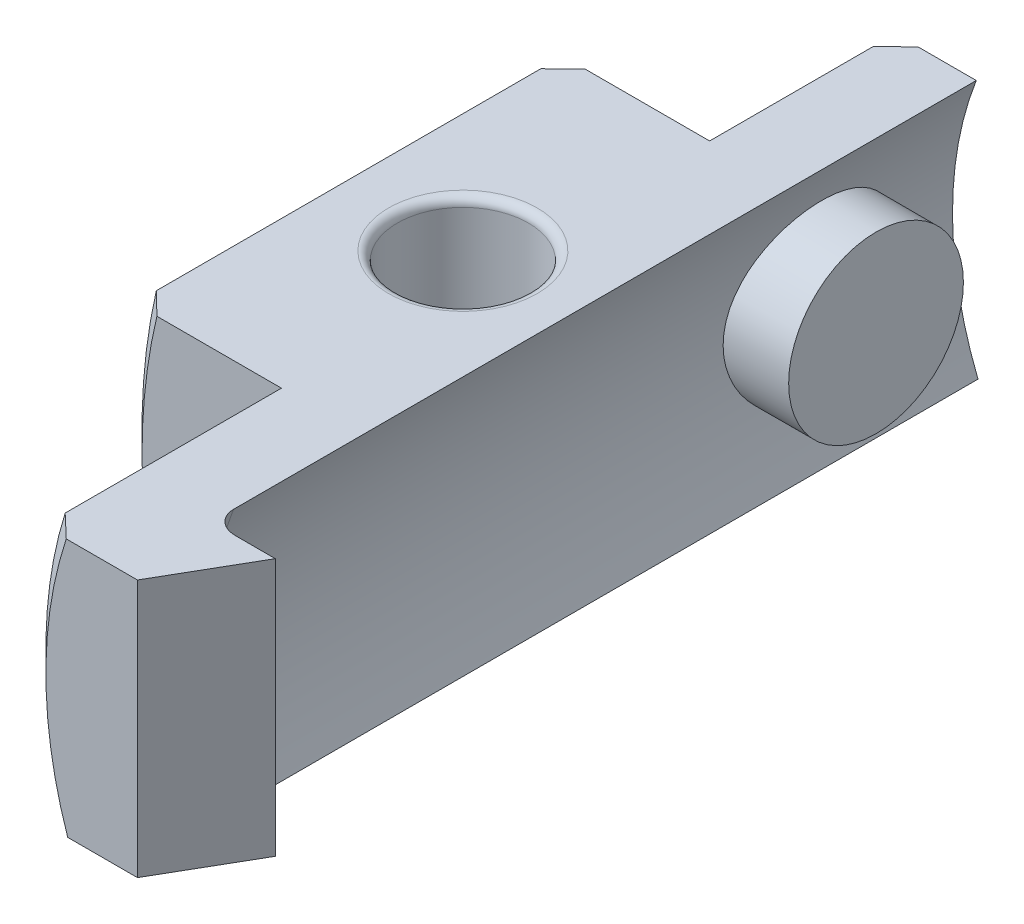
ISO-10303-21;
HEADER;
FILE_DESCRIPTION(('STEP AP214'),'2;1');
FILE_NAME('part.step','',(''),(''),'','','');
FILE_SCHEMA(('AUTOMOTIVE_DESIGN { 1 0 10303 214 1 1 1 1 }'));
ENDSEC;
DATA;
#1=APPLICATION_CONTEXT('core data for automotive mechanical design processes');
#2=APPLICATION_PROTOCOL_DEFINITION('international standard','automotive_design',2000,#1);
#3=PRODUCT_CONTEXT('',#1,'mechanical');
#4=PRODUCT('Part','Part','',(#3));
#5=PRODUCT_RELATED_PRODUCT_CATEGORY('part','',(#4));
#6=PRODUCT_DEFINITION_FORMATION('','',#4);
#7=PRODUCT_DEFINITION_CONTEXT('part definition',#1,'design');
#8=PRODUCT_DEFINITION('design','',#6,#7);
#9=PRODUCT_DEFINITION_SHAPE('','',#8);
#10=(LENGTH_UNIT() NAMED_UNIT(*) SI_UNIT(.MILLI.,.METRE.));
#11=(NAMED_UNIT(*) PLANE_ANGLE_UNIT() SI_UNIT($,.RADIAN.));
#12=(NAMED_UNIT(*) SI_UNIT($,.STERADIAN.) SOLID_ANGLE_UNIT());
#13=UNCERTAINTY_MEASURE_WITH_UNIT(LENGTH_MEASURE(1.E-05),#10,'distance_accuracy_value','');
#14=(GEOMETRIC_REPRESENTATION_CONTEXT(3) GLOBAL_UNCERTAINTY_ASSIGNED_CONTEXT((#13)) GLOBAL_UNIT_ASSIGNED_CONTEXT((#10,
#11,#12)) REPRESENTATION_CONTEXT('',''));
#15=CARTESIAN_POINT('',(0.,0.,0.));
#16=DIRECTION('',(0.,0.,1.));
#17=DIRECTION('',(1.,0.,0.));
#18=AXIS2_PLACEMENT_3D('',#15,#16,#17);
#19=CARTESIAN_POINT('',(0.,0.,19.5));
#20=DIRECTION('',(0.,0.,-1.));
#21=DIRECTION('',(-1.,0.,0.));
#22=AXIS2_PLACEMENT_3D('',#19,#20,#21);
#23=CYLINDRICAL_SURFACE('',#22,8.);
#24=CARTESIAN_POINT('',(-8.,0.,5.25));
#25=CARTESIAN_POINT('',(-7.9999981315735,0.110501451559641,5.24999689901579));
#26=CARTESIAN_POINT('',(-7.99768770842435,0.221037543774351,5.24081126563495));
#27=CARTESIAN_POINT('',(-7.98869485106526,0.438941765027377,5.20436646492399));
#28=CARTESIAN_POINT('',(-7.98200993893301,0.546308062494319,5.17709705394953));
#29=CARTESIAN_POINT('',(-7.96500835109376,0.754694496243435,5.10541432871722));
#30=CARTESIAN_POINT('',(-7.95469603789411,0.855722084573336,5.06102160171297));
#31=CARTESIAN_POINT('',(-7.93153791743495,1.04889617587257,4.95642481327354));
#32=CARTESIAN_POINT('',(-7.91869202472209,1.14104237913168,4.89622021850804));
#33=CARTESIAN_POINT('',(-7.89156551455591,1.31573590306789,4.76039894712776));
#34=CARTESIAN_POINT('',(-7.87726276197502,1.39807425341474,4.68451790005459));
#35=CARTESIAN_POINT('',(-7.84898160157248,1.54899856960443,4.52006372678795));
#36=CARTESIAN_POINT('',(-7.83500323053157,1.61758298259892,4.43148916940409));
#37=CARTESIAN_POINT('',(-7.80873034264225,1.74003539039863,4.24253969768401));
#38=CARTESIAN_POINT('',(-7.79646392619748,1.79366962123352,4.14200902558836));
#39=CARTESIAN_POINT('',(-7.77532659757355,1.88319587806766,3.93300211778662));
#40=CARTESIAN_POINT('',(-7.76645514259225,1.91909074058685,3.82452715555731));
#41=CARTESIAN_POINT('',(-7.7533396892843,1.97140644907302,3.60500866906445));
#42=CARTESIAN_POINT('',(-7.74900654662681,1.98820302444274,3.49406013861601));
#43=CARTESIAN_POINT('',(-7.74519149946122,2.00301570008854,3.27084190800087));
#44=CARTESIAN_POINT('',(-7.74570880570571,2.00103485575748,3.15857242574382));
#45=CARTESIAN_POINT('',(-7.75145607355756,1.97864869951961,2.9387789230062));
#46=CARTESIAN_POINT('',(-7.75657150676391,1.95869112025418,2.83120583804623));
#47=CARTESIAN_POINT('',(-7.77075612894758,1.90163224920399,2.62098526545192));
#48=CARTESIAN_POINT('',(-7.77982559958985,1.86452973609252,2.51833812929477));
#49=CARTESIAN_POINT('',(-7.80100151874212,1.77385263724958,2.31968264499716));
#50=CARTESIAN_POINT('',(-7.81313769959755,1.72011555631056,2.22375177094724));
#51=CARTESIAN_POINT('',(-7.83906281127988,1.59780836801993,2.04210838699091));
#52=CARTESIAN_POINT('',(-7.85285203112837,1.52923566507845,1.95639766924367));
#53=CARTESIAN_POINT('',(-7.88101174053188,1.37688456624163,1.79506184574079));
#54=CARTESIAN_POINT('',(-7.89538759304001,1.29272834422115,1.71979401325153));
#55=CARTESIAN_POINT('',(-7.92274620771675,1.11281589000493,1.5843716767148));
#56=CARTESIAN_POINT('',(-7.93572892732543,1.01705930361059,1.52421763431525));
#57=CARTESIAN_POINT('',(-7.9589030945892,0.816154518241856,1.42059921836749));
#58=CARTESIAN_POINT('',(-7.96908480170303,0.710975190944832,1.37719287966076));
#59=CARTESIAN_POINT('',(-7.98543889321888,0.494501344190511,1.30877692572057));
#60=CARTESIAN_POINT('',(-7.99161204452374,0.383207998867313,1.28376379144248));
#61=CARTESIAN_POINT('',(-7.999139990285,0.160719960520035,1.25338991258822));
#62=CARTESIAN_POINT('',(-8.00061404677705,0.0495956266509458,1.2475426318996));
#63=CARTESIAN_POINT('',(-7.99891739752601,-0.172043833068678,1.25433200274065));
#64=CARTESIAN_POINT('',(-7.99574710989128,-0.28255901285946,1.26696699039884));
#65=CARTESIAN_POINT('',(-7.98519441503143,-0.498152358368656,1.30996121118851));
#66=CARTESIAN_POINT('',(-7.97787512247748,-0.603286825291673,1.34005501796932));
#67=CARTESIAN_POINT('',(-7.95984942178845,-0.807009723270015,1.41680944537126));
#68=CARTESIAN_POINT('',(-7.94914267159856,-0.905597492043513,1.46347173908423));
#69=CARTESIAN_POINT('',(-7.92524410568414,-1.0953641792398,1.5729815051663));
#70=CARTESIAN_POINT('',(-7.91201156489243,-1.18638058911444,1.63610148319568));
#71=CARTESIAN_POINT('',(-7.88459345583226,-1.35670215152433,1.77638654506263));
#72=CARTESIAN_POINT('',(-7.87040772335606,-1.43600527863068,1.85355405282254));
#73=CARTESIAN_POINT('',(-7.84225275947695,-1.58265409076364,2.02200261445929));
#74=CARTESIAN_POINT('',(-7.82829738916375,-1.64965849016271,2.11358360400323));
#75=CARTESIAN_POINT('',(-7.80257171169652,-1.7673476786836,2.30697684595429));
#76=CARTESIAN_POINT('',(-7.79080130756035,-1.81803319221058,2.40878864394634));
#77=CARTESIAN_POINT('',(-7.77090792979554,-1.90126856081239,2.6192076298841));
#78=CARTESIAN_POINT('',(-7.76276340389207,-1.93392586220542,2.72777017112535));
#79=CARTESIAN_POINT('',(-7.75102325453578,-1.98046087993837,2.94907951718548));
#80=CARTESIAN_POINT('',(-7.74742663626581,-1.99434270330488,3.06182540137665));
#81=CARTESIAN_POINT('',(-7.74526534938609,-2.00271812044533,3.28482803180694));
#82=CARTESIAN_POINT('',(-7.74655910304351,-1.99775719704016,3.39506324683297));
#83=CARTESIAN_POINT('',(-7.7537054534379,-1.96983637108382,3.61307185155731));
#84=CARTESIAN_POINT('',(-7.75955795855809,-1.94687683024903,3.72084529068487));
#85=CARTESIAN_POINT('',(-7.77508347576963,-1.88390842592373,3.93027794542054));
#86=CARTESIAN_POINT('',(-7.78473353648412,-1.84400187290717,4.03196974032028));
#87=CARTESIAN_POINT('',(-7.80677007633105,-1.74835321814009,4.22728717695158));
#88=CARTESIAN_POINT('',(-7.81915693494364,-1.69260892004558,4.32091169758255));
#89=CARTESIAN_POINT('',(-7.8456751235135,-1.56515699818285,4.50007283866936));
#90=CARTESIAN_POINT('',(-7.85984353109009,-1.49307088388301,4.58533476456528));
#91=CARTESIAN_POINT('',(-7.88810702995047,-1.33571916158631,4.74272939306054));
#92=CARTESIAN_POINT('',(-7.90220210302746,-1.25045042834819,4.81485897348396));
#93=CARTESIAN_POINT('',(-7.92903540863551,-1.06729011560345,4.94521507808614));
#94=CARTESIAN_POINT('',(-7.94174444487824,-0.969197896421849,5.0031661515621));
#95=CARTESIAN_POINT('',(-7.96406566633491,-0.764354746013968,5.10166328392071));
#96=CARTESIAN_POINT('',(-7.97368006933042,-0.657610084582319,5.14222181419805));
#97=CARTESIAN_POINT('',(-7.98730746087389,-0.459213670991295,5.19876244043954));
#98=CARTESIAN_POINT('',(-7.9920344673692,-0.368506894544091,5.21793499073791));
#99=CARTESIAN_POINT('',(-7.99838140309264,-0.18520809538171,5.24355459149592));
#100=CARTESIAN_POINT('',(-8.00000156601192,-0.0926162149901547,5.25000259907373));
#101=CARTESIAN_POINT('',(-8.,0.,5.25));
#102=B_SPLINE_CURVE_WITH_KNOTS('',3,(#24,#25,#26,#27,#28,#29,#30,#31,#32,#33,#34,#35,#36,#37,
#38,#39,#40,#41,#42,#43,#44,#45,#46,#47,#48,#49,#50,#51,#52,#53,#54,#55,#56,#57,#58,#59,#60,#61,
#62,#63,#64,#65,#66,#67,#68,#69,#70,#71,#72,#73,#74,#75,#76,#77,#78,#79,#80,#81,#82,#83,#84,#85,
#86,#87,#88,#89,#90,#91,#92,#93,#94,#95,#96,#97,#98,#99,#100,#101),.UNSPECIFIED.,.T.,.F.,(4,2,2,
2,2,2,2,2,2,2,2,2,2,2,2,2,2,2,2,2,2,2,2,2,2,2,2,2,2,2,2,2,2,2,2,2,2,2,4),(0.,0.33116494996252,
0.662517650351866,0.993473203048141,1.32443992022577,1.66152580582852,1.99864972773416,
2.34078196727742,2.68285948225824,3.01808393468093,3.3532538415469,3.68029996013785,
4.00736937959145,4.337740371696,4.66816921119311,5.00802001296453,5.34788119415424,
5.68890972016579,6.02987298255951,6.36211078603462,6.69431868154751,7.02160366023144,
7.34892169767481,7.68204783424897,8.01523150681786,8.35659345610395,8.69794025003771,
9.03723006156476,9.37644564340971,9.70591707202577,10.0353818794581,10.3628853408369,
10.6904342418696,11.0265276855097,11.3627009303165,11.7049624733721,12.0469781843289,
12.3245632392729,12.6021274139515),.UNSPECIFIED.);
#103=CARTESIAN_POINT('',(-8.,0.,5.25));
#104=VERTEX_POINT('',#103);
#105=EDGE_CURVE('E216',#104,#104,#102,.T.);
#106=ORIENTED_EDGE('',*,*,#105,.T.);
#107=EDGE_LOOP('',(#106));
#108=FACE_BOUND('',#107,.T.);
#109=DIRECTION('',(0.,0.,-1.));
#110=VECTOR('',#109,1.);
#111=CARTESIAN_POINT('',(-7.45587017054348,2.9,19.5));
#112=LINE('',#111,#110);
#113=CARTESIAN_POINT('',(-7.45587017054348,2.9,17.));
#114=VERTEX_POINT('',#113);
#115=CARTESIAN_POINT('',(-7.45587017054348,2.9,0.));
#116=VERTEX_POINT('',#115);
#117=EDGE_CURVE('E197',#114,#116,#112,.T.);
#118=ORIENTED_EDGE('',*,*,#117,.F.);
#119=CARTESIAN_POINT('',(0.,0.,17.));
#120=DIRECTION('',(0.,0.,1.));
#121=DIRECTION('',(1.,0.,0.));
#122=AXIS2_PLACEMENT_3D('',#119,#120,#121);
#123=CIRCLE('',#122,8.);
#124=CARTESIAN_POINT('',(-7.41619848709566,-3.,17.));
#125=VERTEX_POINT('',#124);
#126=EDGE_CURVE('E259',#114,#125,#123,.T.);
#127=ORIENTED_EDGE('',*,*,#126,.T.);
#128=DIRECTION('',(0.,0.,-1.));
#129=VECTOR('',#128,1.);
#130=CARTESIAN_POINT('',(-7.41619848709566,-3.,19.5));
#131=LINE('',#130,#129);
#132=CARTESIAN_POINT('',(-7.41619848709566,-3.,0.));
#133=VERTEX_POINT('',#132);
#134=EDGE_CURVE('E206',#125,#133,#131,.T.);
#135=ORIENTED_EDGE('',*,*,#134,.T.);
#136=CARTESIAN_POINT('',(0.,0.,0.));
#137=DIRECTION('',(0.,0.,1.));
#138=DIRECTION('',(1.,0.,0.));
#139=AXIS2_PLACEMENT_3D('',#136,#137,#138);
#140=CIRCLE('',#139,8.);
#141=EDGE_CURVE('E195',#116,#133,#140,.T.);
#142=ORIENTED_EDGE('',*,*,#141,.F.);
#143=EDGE_LOOP('',(#118,#127,#135,#142));
#144=FACE_BOUND('',#143,.T.);
#145=ADVANCED_FACE('F33',(#108,#144),#23,.F.);
#146=CARTESIAN_POINT('',(0.,0.,19.5));
#147=DIRECTION('',(0.,0.,-1.));
#148=DIRECTION('',(-1.,0.,0.));
#149=AXIS2_PLACEMENT_3D('',#146,#147,#148);
#150=CYLINDRICAL_SURFACE('',#149,9.75);
#151=DIRECTION('',(0.,0.,-1.));
#152=VECTOR('',#151,1.);
#153=CARTESIAN_POINT('',(-9.30873245936309,2.9,19.5));
#154=LINE('',#153,#152);
#155=CARTESIAN_POINT('',(-9.30873245936309,2.9,4.25));
#156=VERTEX_POINT('',#155);
#157=CARTESIAN_POINT('',(-9.30873245936309,2.9,0.5));
#158=VERTEX_POINT('',#157);
#159=EDGE_CURVE('E212',#156,#158,#154,.T.);
#160=ORIENTED_EDGE('',*,*,#159,.T.);
#161=CARTESIAN_POINT('',(0.,0.,0.5));
#162=DIRECTION('',(0.,0.,1.));
#163=DIRECTION('',(1.,0.,0.));
#164=AXIS2_PLACEMENT_3D('',#161,#162,#163);
#165=CIRCLE('',#164,9.75);
#166=CARTESIAN_POINT('',(-9.27698765763974,-3.,0.500000000000001));
#167=VERTEX_POINT('',#166);
#168=EDGE_CURVE('E365',#158,#167,#165,.T.);
#169=ORIENTED_EDGE('',*,*,#168,.T.);
#170=DIRECTION('',(0.,0.,-1.));
#171=VECTOR('',#170,1.);
#172=CARTESIAN_POINT('',(-9.27698765763974,-3.,19.5));
#173=LINE('',#172,#171);
#174=CARTESIAN_POINT('',(-9.27698765763974,-3.,4.25));
#175=VERTEX_POINT('',#174);
#176=EDGE_CURVE('E208',#175,#167,#173,.T.);
#177=ORIENTED_EDGE('',*,*,#176,.F.);
#178=CARTESIAN_POINT('',(0.,0.,4.25));
#179=DIRECTION('',(0.,0.,1.));
#180=DIRECTION('',(0.,-1.,0.));
#181=AXIS2_PLACEMENT_3D('',#178,#179,#180);
#182=CIRCLE('',#181,9.75);
#183=EDGE_CURVE('E184',#156,#175,#182,.T.);
#184=ORIENTED_EDGE('',*,*,#183,.F.);
#185=EDGE_LOOP('',(#160,#169,#177,#184));
#186=FACE_BOUND('',#185,.T.);
#187=ADVANCED_FACE('F245',(#186),#150,.T.);
#188=CARTESIAN_POINT('',(-9.27698765763974,-3.,19.));
#189=VERTEX_POINT('',#188);
#190=CARTESIAN_POINT('',(-9.27698765763974,-3.,14.05));
#191=VERTEX_POINT('',#190);
#192=EDGE_CURVE('E209',#189,#191,#173,.T.);
#193=ORIENTED_EDGE('',*,*,#192,.F.);
#194=CARTESIAN_POINT('',(0.,0.,19.));
#195=DIRECTION('',(0.,0.,1.));
#196=DIRECTION('',(1.,0.,0.));
#197=AXIS2_PLACEMENT_3D('',#194,#195,#196);
#198=CIRCLE('',#197,9.75);
#199=CARTESIAN_POINT('',(-9.30873245936309,2.9,19.));
#200=VERTEX_POINT('',#199);
#201=EDGE_CURVE('E352',#189,#200,#198,.F.);
#202=ORIENTED_EDGE('',*,*,#201,.T.);
#203=CARTESIAN_POINT('',(-9.30873245936309,2.9,14.05));
#204=VERTEX_POINT('',#203);
#205=EDGE_CURVE('E213',#200,#204,#154,.T.);
#206=ORIENTED_EDGE('',*,*,#205,.T.);
#207=CARTESIAN_POINT('',(0.,0.,14.05));
#208=DIRECTION('',(0.,0.,-1.));
#209=DIRECTION('',(-1.,0.,0.));
#210=AXIS2_PLACEMENT_3D('',#207,#208,#209);
#211=CIRCLE('',#210,9.75);
#212=EDGE_CURVE('E181',#191,#204,#211,.T.);
#213=ORIENTED_EDGE('',*,*,#212,.F.);
#214=EDGE_LOOP('',(#193,#202,#206,#213));
#215=FACE_BOUND('',#214,.T.);
#216=ADVANCED_FACE('F250',(#215),#150,.T.);
#217=CARTESIAN_POINT('',(-7.45587017054348,2.9,19.5));
#218=DIRECTION('',(0.,-1.,0.));
#219=DIRECTION('',(1.,0.,0.));
#220=AXIS2_PLACEMENT_3D('',#217,#218,#219);
#221=PLANE('',#220);
#222=ORIENTED_EDGE('',*,*,#205,.F.);
#223=CARTESIAN_POINT('',(-9.30873245936309,2.9,19.));
#224=CARTESIAN_POINT('',(-9.22133128490023,2.9,19.0834516200441));
#225=CARTESIAN_POINT('',(-9.13387379184637,2.9,19.1668440962327));
#226=CARTESIAN_POINT('',(-8.95884616645285,2.9,19.3335107629022));
#227=CARTESIAN_POINT('',(-8.87127603411048,2.9,19.4167849533803));
#228=CARTESIAN_POINT('',(-8.78364958317441,2.9,19.5));
#229=B_SPLINE_CURVE_WITH_KNOTS('',3,(#223,#224,#225,#226,#227,#228),.UNSPECIFIED.,.F.,.F.,(4,2,
4),(0.,0.362530086455153,0.725060181625396),.UNSPECIFIED.);
#230=CARTESIAN_POINT('',(-8.78364958317441,2.9,19.5));
#231=VERTEX_POINT('',#230);
#232=EDGE_CURVE('E330',#200,#231,#229,.T.);
#233=ORIENTED_EDGE('',*,*,#232,.T.);
#234=DIRECTION('',(-1.,0.,0.));
#235=VECTOR('',#234,1.);
#236=CARTESIAN_POINT('',(-7.45587017054348,2.9,19.5));
#237=LINE('',#236,#235);
#238=CARTESIAN_POINT('',(-7.15470053837925,2.9,19.5));
#239=VERTEX_POINT('',#238);
#240=EDGE_CURVE('E191',#239,#231,#237,.T.);
#241=ORIENTED_EDGE('',*,*,#240,.F.);
#242=DIRECTION('',(-0.499999999999998,0.,0.86602540378444));
#243=VECTOR('',#242,1.);
#244=CARTESIAN_POINT('',(-6.,2.9,17.5));
#245=LINE('',#244,#243);
#246=CARTESIAN_POINT('',(-6.,2.9,17.5));
#247=VERTEX_POINT('',#246);
#248=EDGE_CURVE('E266',#239,#247,#245,.F.);
#249=ORIENTED_EDGE('',*,*,#248,.T.);
#250=DIRECTION('',(-1.,0.,0.));
#251=VECTOR('',#250,1.);
#252=CARTESIAN_POINT('',(-6.,2.9,17.5));
#253=LINE('',#252,#251);
#254=CARTESIAN_POINT('',(-6.91664658631623,2.9,17.5));
#255=VERTEX_POINT('',#254);
#256=EDGE_CURVE('E161',#247,#255,#253,.T.);
#257=ORIENTED_EDGE('',*,*,#256,.T.);
#258=CARTESIAN_POINT('',(-6.91664658631623,2.9,17.5));
#259=CARTESIAN_POINT('',(-6.94889283794756,2.9,17.5000162335904));
#260=CARTESIAN_POINT('',(-6.98115213450423,2.9,17.4973472468017));
#261=CARTESIAN_POINT('',(-7.04484792848508,2.9,17.4867011426051));
#262=CARTESIAN_POINT('',(-7.07628262064339,2.9,17.4787132493263));
#263=CARTESIAN_POINT('',(-7.13738942294036,2.9,17.4574756045634));
#264=CARTESIAN_POINT('',(-7.16705870824012,2.9,17.4442176676465));
#265=CARTESIAN_POINT('',(-7.22357326057289,2.9,17.4126806712551));
#266=CARTESIAN_POINT('',(-7.25042142414706,2.9,17.3944068328316));
#267=CARTESIAN_POINT('',(-7.29914165847935,2.9,17.3542078361851));
#268=CARTESIAN_POINT('',(-7.32118834429986,2.9,17.332494758281));
#269=CARTESIAN_POINT('',(-7.36097420781519,2.9,17.2854053717717));
#270=CARTESIAN_POINT('',(-7.37871354566512,2.9,17.2600291994229));
#271=CARTESIAN_POINT('',(-7.40797368451349,2.9,17.2083746421084));
#272=CARTESIAN_POINT('',(-7.41985668612586,2.9,17.1823009067683));
#273=CARTESIAN_POINT('',(-7.43874480275104,2.9,17.1284631733448));
#274=CARTESIAN_POINT('',(-7.44575819041961,2.9,17.1007021294268));
#275=CARTESIAN_POINT('',(-7.45208053267917,2.9,17.0605608268903));
#276=CARTESIAN_POINT('',(-7.45350141073343,2.9,17.0484830281086));
#277=CARTESIAN_POINT('',(-7.45539530560076,2.9,17.0242722863944));
#278=CARTESIAN_POINT('',(-7.45586979640589,2.9,17.0121394587601));
#279=CARTESIAN_POINT('',(-7.45587017054352,2.9,17.));
#280=B_SPLINE_CURVE_WITH_KNOTS('',3,(#258,#259,#260,#261,#262,#263,#264,#265,#266,#267,#268,
#269,#270,#271,#272,#273,#274,#275,#276,#277,#278,#279),.UNSPECIFIED.,.F.,.F.,(4,2,2,2,2,2,2,2,
2,2,4),(0.,0.0966503240106927,0.193497055524179,0.290494800870916,0.387391961675036,
0.479733126413361,0.572070857211711,0.657596914226726,0.742977318986171,0.779430107294558,
0.815826076146061),.UNSPECIFIED.);
#281=EDGE_CURVE('E264',#255,#114,#280,.T.);
#282=ORIENTED_EDGE('',*,*,#281,.T.);
#283=ORIENTED_EDGE('',*,*,#117,.T.);
#284=DIRECTION('',(-1.,0.,0.));
#285=VECTOR('',#284,1.);
#286=CARTESIAN_POINT('',(-7.45587017054348,2.9,0.));
#287=LINE('',#286,#285);
#288=CARTESIAN_POINT('',(-8.78364958317441,2.9,0.));
#289=VERTEX_POINT('',#288);
#290=EDGE_CURVE('E190',#116,#289,#287,.T.);
#291=ORIENTED_EDGE('',*,*,#290,.T.);
#292=CARTESIAN_POINT('',(-8.78364958317441,2.9,0.));
#293=CARTESIAN_POINT('',(-8.87127603411048,2.9,0.083215046619741));
#294=CARTESIAN_POINT('',(-8.95884616645285,2.9,0.166489237097815));
#295=CARTESIAN_POINT('',(-9.13387379184637,2.9,0.333155903767325));
#296=CARTESIAN_POINT('',(-9.22133128490023,2.9,0.416548379955918));
#297=CARTESIAN_POINT('',(-9.30873245936309,2.9,0.5));
#298=B_SPLINE_CURVE_WITH_KNOTS('',3,(#292,#293,#294,#295,#296,#297),.UNSPECIFIED.,.F.,.F.,(4,2,
4),(0.,0.362530095170241,0.725060181625393),.UNSPECIFIED.);
#299=EDGE_CURVE('E324',#289,#158,#298,.T.);
#300=ORIENTED_EDGE('',*,*,#299,.T.);
#301=ORIENTED_EDGE('',*,*,#159,.F.);
#302=DIRECTION('',(1.,0.,0.));
#303=VECTOR('',#302,1.);
#304=CARTESIAN_POINT('',(-10.25,2.9,4.25));
#305=LINE('',#304,#303);
#306=CARTESIAN_POINT('',(-12.1589473228565,2.9,4.25));
#307=VERTEX_POINT('',#306);
#308=EDGE_CURVE('E179',#307,#156,#305,.T.);
#309=ORIENTED_EDGE('',*,*,#308,.F.);
#310=CARTESIAN_POINT('',(-12.1589473228565,2.9,4.25));
#311=CARTESIAN_POINT('',(-12.2445691743934,2.9,4.33328755762221));
#312=CARTESIAN_POINT('',(-12.3301687381657,2.9,4.41659800315845));
#313=CARTESIAN_POINT('',(-12.5013232899415,2.9,4.58326466982525));
#314=CARTESIAN_POINT('',(-12.5868782779449,2.9,4.66662089095567));
#315=CARTESIAN_POINT('',(-12.6724109781841,2.9,4.75));
#316=B_SPLINE_CURVE_WITH_KNOTS('',3,(#310,#311,#312,#313,#314,#315),.UNSPECIFIED.,.F.,.F.,(4,2,
4),(0.,0.358345142120282,0.716690283235344),.UNSPECIFIED.);
#317=CARTESIAN_POINT('',(-12.6724109781841,2.9,4.75));
#318=VERTEX_POINT('',#317);
#319=EDGE_CURVE('E331',#307,#318,#316,.T.);
#320=ORIENTED_EDGE('',*,*,#319,.T.);
#321=DIRECTION('',(0.,0.,1.));
#322=VECTOR('',#321,1.);
#323=CARTESIAN_POINT('',(-12.6724109781841,2.9,0.));
#324=LINE('',#323,#322);
#325=CARTESIAN_POINT('',(-12.6724109781841,2.9,13.55));
#326=VERTEX_POINT('',#325);
#327=EDGE_CURVE('E160',#318,#326,#324,.T.);
#328=ORIENTED_EDGE('',*,*,#327,.T.);
#329=CARTESIAN_POINT('',(-12.6724109781841,2.9,13.55));
#330=CARTESIAN_POINT('',(-12.5868782779449,2.9,13.6333791090443));
#331=CARTESIAN_POINT('',(-12.5013232899415,2.9,13.7167353301748));
#332=CARTESIAN_POINT('',(-12.3301687381657,2.9,13.8834019968416));
#333=CARTESIAN_POINT('',(-12.2445691743934,2.9,13.9667124423778));
#334=CARTESIAN_POINT('',(-12.1589473228565,2.9,14.05));
#335=B_SPLINE_CURVE_WITH_KNOTS('',3,(#329,#330,#331,#332,#333,#334),.UNSPECIFIED.,.F.,.F.,(4,2,
4),(0.,0.358345141115061,0.716690283235341),.UNSPECIFIED.);
#336=CARTESIAN_POINT('',(-12.1589473228565,2.9,14.05));
#337=VERTEX_POINT('',#336);
#338=EDGE_CURVE('E49',#326,#337,#335,.T.);
#339=ORIENTED_EDGE('',*,*,#338,.T.);
#340=DIRECTION('',(1.,0.,0.));
#341=VECTOR('',#340,1.);
#342=CARTESIAN_POINT('',(-10.25,2.9,14.05));
#343=LINE('',#342,#341);
#344=EDGE_CURVE('E172',#337,#204,#343,.T.);
#345=ORIENTED_EDGE('',*,*,#344,.T.);
#346=EDGE_LOOP('',(#222,#233,#241,#249,#257,#282,#283,#291,#300,#301,#309,#320,#328,#339,#345));
#347=FACE_BOUND('',#346,.T.);
#348=CARTESIAN_POINT('',(-9.95587017054348,2.9,9.25));
#349=DIRECTION('',(0.,-1.,0.));
#350=DIRECTION('',(1.,0.,0.));
#351=AXIS2_PLACEMENT_3D('',#348,#349,#350);
#352=CIRCLE('',#351,1.7);
#353=CARTESIAN_POINT('',(-8.25587017054348,2.9,9.25));
#354=VERTEX_POINT('',#353);
#355=EDGE_CURVE('E150',#354,#354,#352,.T.);
#356=ORIENTED_EDGE('',*,*,#355,.T.);
#357=EDGE_LOOP('',(#356));
#358=FACE_BOUND('',#357,.T.);
#359=ADVANCED_FACE('F287',(#347,#358),#221,.F.);
#360=CARTESIAN_POINT('',(-7.41619848709566,-3.,19.5));
#361=DIRECTION('',(0.,-1.,0.));
#362=DIRECTION('',(1.,0.,0.));
#363=AXIS2_PLACEMENT_3D('',#360,#361,#362);
#364=PLANE('',#363);
#365=DIRECTION('',(-1.,0.,0.));
#366=VECTOR('',#365,1.);
#367=CARTESIAN_POINT('',(-7.41619848709566,-3.,19.5));
#368=LINE('',#367,#366);
#369=CARTESIAN_POINT('',(-7.15470053837925,-3.,19.5));
#370=VERTEX_POINT('',#369);
#371=CARTESIAN_POINT('',(-8.75,-3.,19.5));
#372=VERTEX_POINT('',#371);
#373=EDGE_CURVE('E194',#370,#372,#368,.T.);
#374=ORIENTED_EDGE('',*,*,#373,.T.);
#375=CARTESIAN_POINT('',(-8.75,-3.,19.5));
#376=CARTESIAN_POINT('',(-8.83795267121449,-3.,19.4167946114822));
#377=CARTESIAN_POINT('',(-8.92584464557065,-3.,19.333525249974));
#378=CARTESIAN_POINT('',(-9.10150719811384,-3.,19.1668585833038));
#379=CARTESIAN_POINT('',(-9.18927777630426,-3.,19.0834612781453));
#380=CARTESIAN_POINT('',(-9.27698765763974,-3.,19.));
#381=B_SPLINE_CURVE_WITH_KNOTS('',3,(#375,#376,#377,#378,#379,#380),.UNSPECIFIED.,.F.,.F.,(4,2,
4),(0.,0.363220417239782,0.726440824337456),.UNSPECIFIED.);
#382=EDGE_CURVE('E309',#372,#189,#381,.T.);
#383=ORIENTED_EDGE('',*,*,#382,.T.);
#384=ORIENTED_EDGE('',*,*,#192,.T.);
#385=DIRECTION('',(1.,0.,0.));
#386=VECTOR('',#385,1.);
#387=CARTESIAN_POINT('',(-10.25,-3.,14.05));
#388=LINE('',#387,#386);
#389=CARTESIAN_POINT('',(-12.1346610995116,-3.,14.05));
#390=VERTEX_POINT('',#389);
#391=EDGE_CURVE('E175',#390,#191,#388,.T.);
#392=ORIENTED_EDGE('',*,*,#391,.F.);
#393=CARTESIAN_POINT('',(-12.1346610995116,-3.,14.05));
#394=CARTESIAN_POINT('',(-12.2204505734588,-3.,13.9667159339391));
#395=CARTESIAN_POINT('',(-12.3062161055985,-3.,13.8834072341744));
#396=CARTESIAN_POINT('',(-12.4776992859857,-3.,13.7167405675076));
#397=CARTESIAN_POINT('',(-12.5634169342332,-3.,13.6333826006056));
#398=CARTESIAN_POINT('',(-12.6491106406735,-3.,13.55));
#399=B_SPLINE_CURVE_WITH_KNOTS('',3,(#393,#394,#395,#396,#397,#398),.UNSPECIFIED.,.F.,.F.,(4,2,
4),(0.,0.358698471751942,0.717396942342782),.UNSPECIFIED.);
#400=CARTESIAN_POINT('',(-12.6491106406735,-3.,13.55));
#401=VERTEX_POINT('',#400);
#402=EDGE_CURVE('E294',#390,#401,#399,.T.);
#403=ORIENTED_EDGE('',*,*,#402,.T.);
#404=DIRECTION('',(0.,0.,1.));
#405=VECTOR('',#404,1.);
#406=CARTESIAN_POINT('',(-12.6491106406735,-3.,0.));
#407=LINE('',#406,#405);
#408=CARTESIAN_POINT('',(-12.6491106406735,-3.,4.75));
#409=VERTEX_POINT('',#408);
#410=EDGE_CURVE('E169',#409,#401,#407,.T.);
#411=ORIENTED_EDGE('',*,*,#410,.F.);
#412=CARTESIAN_POINT('',(-12.6491106406735,-3.,4.75));
#413=CARTESIAN_POINT('',(-12.5634169342332,-3.,4.66661739939444));
#414=CARTESIAN_POINT('',(-12.4776992859857,-3.,4.58325943249239));
#415=CARTESIAN_POINT('',(-12.3062161055985,-3.,4.41659276582557));
#416=CARTESIAN_POINT('',(-12.2204505734588,-3.,4.33328406606095));
#417=CARTESIAN_POINT('',(-12.1346610995116,-3.,4.25));
#418=B_SPLINE_CURVE_WITH_KNOTS('',3,(#412,#413,#414,#415,#416,#417),.UNSPECIFIED.,.F.,.F.,(4,2,
4),(0.,0.358698470590842,0.717396942342785),.UNSPECIFIED.);
#419=CARTESIAN_POINT('',(-12.1346610995116,-3.,4.25));
#420=VERTEX_POINT('',#419);
#421=EDGE_CURVE('E299',#409,#420,#418,.T.);
#422=ORIENTED_EDGE('',*,*,#421,.T.);
#423=DIRECTION('',(1.,0.,0.));
#424=VECTOR('',#423,1.);
#425=CARTESIAN_POINT('',(-10.25,-3.,4.25));
#426=LINE('',#425,#424);
#427=EDGE_CURVE('E177',#420,#175,#426,.T.);
#428=ORIENTED_EDGE('',*,*,#427,.T.);
#429=ORIENTED_EDGE('',*,*,#176,.T.);
#430=CARTESIAN_POINT('',(-9.27698765763974,-3.,0.5));
#431=CARTESIAN_POINT('',(-9.18927777630426,-3.,0.416538721854696));
#432=CARTESIAN_POINT('',(-9.10150719811384,-3.,0.333141416696208));
#433=CARTESIAN_POINT('',(-8.92584464557065,-3.,0.166474750025968));
#434=CARTESIAN_POINT('',(-8.83795267121448,-3.,0.0832053885177893));
#435=CARTESIAN_POINT('',(-8.75,-3.,0.));
#436=B_SPLINE_CURVE_WITH_KNOTS('',3,(#430,#431,#432,#433,#434,#435),.UNSPECIFIED.,.F.,.F.,(4,2,
4),(0.,0.363220407097677,0.726440824337456),.UNSPECIFIED.);
#437=CARTESIAN_POINT('',(-8.75,-3.,0.));
#438=VERTEX_POINT('',#437);
#439=EDGE_CURVE('E304',#167,#438,#436,.T.);
#440=ORIENTED_EDGE('',*,*,#439,.T.);
#441=DIRECTION('',(-1.,0.,0.));
#442=VECTOR('',#441,1.);
#443=CARTESIAN_POINT('',(-7.41619848709566,-3.,0.));
#444=LINE('',#443,#442);
#445=EDGE_CURVE('E200',#133,#438,#444,.T.);
#446=ORIENTED_EDGE('',*,*,#445,.F.);
#447=ORIENTED_EDGE('',*,*,#134,.F.);
#448=CARTESIAN_POINT('',(-7.41619848709566,-3.,17.));
#449=CARTESIAN_POINT('',(-7.41623003598426,-3.,17.0266259518563));
#450=CARTESIAN_POINT('',(-7.41390643983973,-3.,17.0532335778423));
#451=CARTESIAN_POINT('',(-7.4047953680568,-3.,17.105602050097));
#452=CARTESIAN_POINT('',(-7.39801997115362,-3.,17.1313649901652));
#453=CARTESIAN_POINT('',(-7.38025106550336,-3.,17.1813809125935));
#454=CARTESIAN_POINT('',(-7.36925838503956,-3.,17.2056341903679));
#455=CARTESIAN_POINT('',(-7.34346857082779,-3.,17.2520277245217));
#456=CARTESIAN_POINT('',(-7.3286700425553,-3.,17.2741672022842));
#457=CARTESIAN_POINT('',(-7.29529205836679,-3.,17.3164271330914));
#458=CARTESIAN_POINT('',(-7.27661606180332,-3.,17.3364711598458));
#459=CARTESIAN_POINT('',(-7.23636039290198,-3.,17.3733855932398));
#460=CARTESIAN_POINT('',(-7.21478009245141,-3.,17.390255311475));
#461=CARTESIAN_POINT('',(-7.16774791022743,-3.,17.4215913516038));
#462=CARTESIAN_POINT('',(-7.14213140696819,-3.,17.4358103161782));
#463=CARTESIAN_POINT('',(-7.08899051005387,-3.,17.4600929799819));
#464=CARTESIAN_POINT('',(-7.06146506134802,-3.,17.4701543596438));
#465=CARTESIAN_POINT('',(-7.0074130376966,-3.,17.4853825084576));
#466=CARTESIAN_POINT('',(-6.98097562674323,-3.,17.4908694510518));
#467=CARTESIAN_POINT('',(-6.92764489325423,-3.,17.4981779851279));
#468=CARTESIAN_POINT('',(-6.90075244631295,-3.,17.500005952787));
#469=CARTESIAN_POINT('',(-6.87386354243376,-3.,17.5));
#470=B_SPLINE_CURVE_WITH_KNOTS('',3,(#448,#449,#450,#451,#452,#453,#454,#455,#456,#457,#458,
#459,#460,#461,#462,#463,#464,#465,#466,#467,#468,#469),.UNSPECIFIED.,.F.,.F.,(4,2,2,2,2,2,2,2,
2,2,4),(0.,0.079748296755155,0.159281107043779,0.238798304912891,0.318344680792028,
0.400179939690227,0.482032925595486,0.569554616462783,0.657125071037667,0.737875370028695,
0.818484829561728),.UNSPECIFIED.);
#471=CARTESIAN_POINT('',(-6.87386354243376,-3.,17.5));
#472=VERTEX_POINT('',#471);
#473=EDGE_CURVE('E157',#125,#472,#470,.T.);
#474=ORIENTED_EDGE('',*,*,#473,.T.);
#475=DIRECTION('',(-1.,0.,0.));
#476=VECTOR('',#475,1.);
#477=CARTESIAN_POINT('',(-6.,-3.,17.5));
#478=LINE('',#477,#476);
#479=CARTESIAN_POINT('',(-6.,-3.,17.5));
#480=VERTEX_POINT('',#479);
#481=EDGE_CURVE('E153',#480,#472,#478,.T.);
#482=ORIENTED_EDGE('',*,*,#481,.F.);
#483=DIRECTION('',(0.499999999999998,0.,-0.86602540378444));
#484=VECTOR('',#483,1.);
#485=CARTESIAN_POINT('',(-7.22007502555835,-3.,19.613231933313));
#486=LINE('',#485,#484);
#487=EDGE_CURVE('E140',#480,#370,#486,.F.);
#488=ORIENTED_EDGE('',*,*,#487,.T.);
#489=EDGE_LOOP('',(#374,#383,#384,#392,#403,#411,#422,#428,#429,#440,#446,#447,#474,#482,#488));
#490=FACE_BOUND('',#489,.T.);
#491=CARTESIAN_POINT('',(-9.95587017054348,-3.,9.25));
#492=DIRECTION('',(0.,-1.,0.));
#493=DIRECTION('',(1.,0.,0.));
#494=AXIS2_PLACEMENT_3D('',#491,#492,#493);
#495=CIRCLE('',#494,1.7);
#496=CARTESIAN_POINT('',(-8.25587017054348,-3.,9.25));
#497=VERTEX_POINT('',#496);
#498=EDGE_CURVE('E223',#497,#497,#495,.F.);
#499=ORIENTED_EDGE('',*,*,#498,.T.);
#500=EDGE_LOOP('',(#499));
#501=FACE_BOUND('',#500,.T.);
#502=ADVANCED_FACE('F154',(#490,#501),#364,.T.);
#503=CARTESIAN_POINT('',(0.,0.,19.5));
#504=DIRECTION('',(0.,0.,1.));
#505=DIRECTION('',(1.,0.,0.));
#506=AXIS2_PLACEMENT_3D('',#503,#504,#505);
#507=PLANE('',#506);
#508=ORIENTED_EDGE('',*,*,#240,.T.);
#509=CARTESIAN_POINT('',(0.,0.,19.5));
#510=DIRECTION('',(0.,0.,1.));
#511=DIRECTION('',(1.,0.,0.));
#512=AXIS2_PLACEMENT_3D('',#509,#510,#511);
#513=CIRCLE('',#512,9.25);
#514=EDGE_CURVE('E363',#231,#372,#513,.T.);
#515=ORIENTED_EDGE('',*,*,#514,.T.);
#516=ORIENTED_EDGE('',*,*,#373,.F.);
#517=DIRECTION('',(0.,1.,0.));
#518=VECTOR('',#517,1.);
#519=CARTESIAN_POINT('',(-7.15470053837925,0.,19.5));
#520=LINE('',#519,#518);
#521=EDGE_CURVE('E146',#370,#239,#520,.T.);
#522=ORIENTED_EDGE('',*,*,#521,.T.);
#523=EDGE_LOOP('',(#508,#515,#516,#522));
#524=FACE_BOUND('',#523,.T.);
#525=ADVANCED_FACE('F237',(#524),#507,.T.);
#526=CARTESIAN_POINT('',(0.,0.,0.));
#527=DIRECTION('',(0.,0.,1.));
#528=DIRECTION('',(1.,0.,0.));
#529=AXIS2_PLACEMENT_3D('',#526,#527,#528);
#530=PLANE('',#529);
#531=ORIENTED_EDGE('',*,*,#445,.T.);
#532=CARTESIAN_POINT('',(0.,0.,0.));
#533=DIRECTION('',(0.,0.,1.));
#534=DIRECTION('',(1.,0.,0.));
#535=AXIS2_PLACEMENT_3D('',#532,#533,#534);
#536=CIRCLE('',#535,9.25);
#537=EDGE_CURVE('E367',#438,#289,#536,.F.);
#538=ORIENTED_EDGE('',*,*,#537,.T.);
#539=ORIENTED_EDGE('',*,*,#290,.F.);
#540=ORIENTED_EDGE('',*,*,#141,.T.);
#541=EDGE_LOOP('',(#531,#538,#539,#540));
#542=FACE_BOUND('',#541,.T.);
#543=ADVANCED_FACE('F234',(#542),#530,.F.);
#544=CARTESIAN_POINT('',(-6.5,0.,3.25));
#545=DIRECTION('',(-1.,0.,0.));
#546=DIRECTION('',(0.,0.,1.));
#547=AXIS2_PLACEMENT_3D('',#544,#545,#546);
#548=CYLINDRICAL_SURFACE('',#547,2.);
#549=ORIENTED_EDGE('',*,*,#105,.F.);
#550=EDGE_LOOP('',(#549));
#551=FACE_BOUND('',#550,.T.);
#552=CARTESIAN_POINT('',(-6.5,0.,3.25));
#553=DIRECTION('',(1.,0.,0.));
#554=DIRECTION('',(0.,0.,-1.));
#555=AXIS2_PLACEMENT_3D('',#552,#553,#554);
#556=CIRCLE('',#555,2.);
#557=CARTESIAN_POINT('',(-6.5,0.,1.25));
#558=VERTEX_POINT('',#557);
#559=EDGE_CURVE('E187',#558,#558,#556,.T.);
#560=ORIENTED_EDGE('',*,*,#559,.F.);
#561=EDGE_LOOP('',(#560));
#562=FACE_BOUND('',#561,.T.);
#563=ADVANCED_FACE('F228',(#551,#562),#548,.T.);
#564=CARTESIAN_POINT('',(-6.5,0.,3.25));
#565=DIRECTION('',(1.,0.,0.));
#566=DIRECTION('',(0.,0.,-1.));
#567=AXIS2_PLACEMENT_3D('',#564,#565,#566);
#568=PLANE('',#567);
#569=ORIENTED_EDGE('',*,*,#559,.T.);
#570=EDGE_LOOP('',(#569));
#571=FACE_BOUND('',#570,.T.);
#572=ADVANCED_FACE('F233',(#571),#568,.T.);
#573=CARTESIAN_POINT('',(-10.25,2.9,4.25));
#574=DIRECTION('',(0.,0.,1.));
#575=DIRECTION('',(0.,-1.,0.));
#576=AXIS2_PLACEMENT_3D('',#573,#574,#575);
#577=PLANE('',#576);
#578=ORIENTED_EDGE('',*,*,#427,.F.);
#579=CARTESIAN_POINT('',(0.,0.,4.25));
#580=DIRECTION('',(0.,0.,1.));
#581=DIRECTION('',(0.,-1.,0.));
#582=AXIS2_PLACEMENT_3D('',#579,#580,#581);
#583=CIRCLE('',#582,12.5);
#584=EDGE_CURVE('E372',#420,#307,#583,.F.);
#585=ORIENTED_EDGE('',*,*,#584,.T.);
#586=ORIENTED_EDGE('',*,*,#308,.T.);
#587=ORIENTED_EDGE('',*,*,#183,.T.);
#588=EDGE_LOOP('',(#578,#585,#586,#587));
#589=FACE_BOUND('',#588,.T.);
#590=ADVANCED_FACE('F421',(#589),#577,.F.);
#591=CARTESIAN_POINT('',(-10.25,-3.,14.05));
#592=DIRECTION('',(0.,0.,-1.));
#593=DIRECTION('',(-1.,0.,0.));
#594=AXIS2_PLACEMENT_3D('',#591,#592,#593);
#595=PLANE('',#594);
#596=ORIENTED_EDGE('',*,*,#344,.F.);
#597=CARTESIAN_POINT('',(0.,0.,14.05));
#598=DIRECTION('',(0.,0.,-1.));
#599=DIRECTION('',(-1.,0.,0.));
#600=AXIS2_PLACEMENT_3D('',#597,#598,#599);
#601=CIRCLE('',#600,12.5);
#602=EDGE_CURVE('E11',#337,#390,#601,.F.);
#603=ORIENTED_EDGE('',*,*,#602,.T.);
#604=ORIENTED_EDGE('',*,*,#391,.T.);
#605=ORIENTED_EDGE('',*,*,#212,.T.);
#606=EDGE_LOOP('',(#596,#603,#604,#605));
#607=FACE_BOUND('',#606,.T.);
#608=ADVANCED_FACE('F416',(#607),#595,.F.);
#609=CARTESIAN_POINT('',(0.,0.,0.));
#610=DIRECTION('',(0.,0.,1.));
#611=DIRECTION('',(1.,0.,0.));
#612=AXIS2_PLACEMENT_3D('',#609,#610,#611);
#613=CYLINDRICAL_SURFACE('',#612,13.);
#614=ORIENTED_EDGE('',*,*,#327,.F.);
#615=CARTESIAN_POINT('',(0.,0.,4.75));
#616=DIRECTION('',(0.,0.,1.));
#617=DIRECTION('',(1.,0.,0.));
#618=AXIS2_PLACEMENT_3D('',#615,#616,#617);
#619=CIRCLE('',#618,13.);
#620=EDGE_CURVE('E42',#318,#409,#619,.T.);
#621=ORIENTED_EDGE('',*,*,#620,.T.);
#622=ORIENTED_EDGE('',*,*,#410,.T.);
#623=CARTESIAN_POINT('',(0.,0.,13.55));
#624=DIRECTION('',(0.,0.,-1.));
#625=DIRECTION('',(-1.,0.,0.));
#626=AXIS2_PLACEMENT_3D('',#623,#624,#625);
#627=CIRCLE('',#626,13.);
#628=EDGE_CURVE('E377',#401,#326,#627,.T.);
#629=ORIENTED_EDGE('',*,*,#628,.T.);
#630=EDGE_LOOP('',(#614,#621,#622,#629));
#631=FACE_BOUND('',#630,.T.);
#632=ADVANCED_FACE('F382',(#631),#613,.T.);
#633=CARTESIAN_POINT('',(-9.95587017054348,-3.,9.25));
#634=DIRECTION('',(0.,1.,0.));
#635=DIRECTION('',(-1.,0.,0.));
#636=AXIS2_PLACEMENT_3D('',#633,#634,#635);
#637=CYLINDRICAL_SURFACE('',#636,1.5);
#638=CARTESIAN_POINT('',(-9.95587017054348,-2.8,9.25));
#639=DIRECTION('',(0.,-1.,0.));
#640=DIRECTION('',(1.,0.,0.));
#641=AXIS2_PLACEMENT_3D('',#638,#639,#640);
#642=CIRCLE('',#641,1.5);
#643=CARTESIAN_POINT('',(-8.45587017054348,-2.8,9.25));
#644=VERTEX_POINT('',#643);
#645=EDGE_CURVE('E392',#644,#644,#642,.T.);
#646=ORIENTED_EDGE('',*,*,#645,.T.);
#647=EDGE_LOOP('',(#646));
#648=FACE_BOUND('',#647,.T.);
#649=CARTESIAN_POINT('',(-9.95587017054348,2.7,9.25));
#650=DIRECTION('',(0.,-1.,0.));
#651=DIRECTION('',(1.,0.,0.));
#652=AXIS2_PLACEMENT_3D('',#649,#650,#651);
#653=CIRCLE('',#652,1.5);
#654=CARTESIAN_POINT('',(-8.45587017054348,2.7,9.25));
#655=VERTEX_POINT('',#654);
#656=EDGE_CURVE('E394',#655,#655,#653,.F.);
#657=ORIENTED_EDGE('',*,*,#656,.T.);
#658=EDGE_LOOP('',(#657));
#659=FACE_BOUND('',#658,.T.);
#660=ADVANCED_FACE('F403',(#648,#659),#637,.F.);
#661=CARTESIAN_POINT('',(-9.95587017054348,-2.8,9.25));
#662=DIRECTION('',(0.,-1.,0.));
#663=DIRECTION('',(1.,0.,0.));
#664=AXIS2_PLACEMENT_3D('',#661,#662,#663);
#665=TOROIDAL_SURFACE('',#664,1.7,0.2);
#666=ORIENTED_EDGE('',*,*,#645,.F.);
#667=EDGE_LOOP('',(#666));
#668=FACE_BOUND('',#667,.T.);
#669=ORIENTED_EDGE('',*,*,#498,.F.);
#670=EDGE_LOOP('',(#669));
#671=FACE_BOUND('',#670,.T.);
#672=ADVANCED_FACE('F343',(#668,#671),#665,.T.);
#673=CARTESIAN_POINT('',(-9.95587017054348,2.7,9.25));
#674=DIRECTION('',(0.,-1.,0.));
#675=DIRECTION('',(1.,0.,0.));
#676=AXIS2_PLACEMENT_3D('',#673,#674,#675);
#677=TOROIDAL_SURFACE('',#676,1.7,0.2);
#678=ORIENTED_EDGE('',*,*,#355,.F.);
#679=EDGE_LOOP('',(#678));
#680=FACE_BOUND('',#679,.T.);
#681=ORIENTED_EDGE('',*,*,#656,.F.);
#682=EDGE_LOOP('',(#681));
#683=FACE_BOUND('',#682,.T.);
#684=ADVANCED_FACE('F402',(#680,#683),#677,.T.);
#685=CARTESIAN_POINT('',(-6.,-3.,17.5));
#686=DIRECTION('',(0.,0.,1.));
#687=DIRECTION('',(1.,0.,0.));
#688=AXIS2_PLACEMENT_3D('',#685,#686,#687);
#689=PLANE('',#688);
#690=ORIENTED_EDGE('',*,*,#481,.T.);
#691=CARTESIAN_POINT('',(0.,0.,17.5));
#692=DIRECTION('',(0.,0.,1.));
#693=DIRECTION('',(1.,0.,0.));
#694=AXIS2_PLACEMENT_3D('',#691,#692,#693);
#695=CIRCLE('',#694,7.5);
#696=EDGE_CURVE('E265',#472,#255,#695,.F.);
#697=ORIENTED_EDGE('',*,*,#696,.T.);
#698=ORIENTED_EDGE('',*,*,#256,.F.);
#699=DIRECTION('',(0.,1.,0.));
#700=VECTOR('',#699,1.);
#701=CARTESIAN_POINT('',(-6.,-3.,17.5));
#702=LINE('',#701,#700);
#703=EDGE_CURVE('E145',#480,#247,#702,.T.);
#704=ORIENTED_EDGE('',*,*,#703,.F.);
#705=EDGE_LOOP('',(#690,#697,#698,#704));
#706=FACE_BOUND('',#705,.T.);
#707=ADVANCED_FACE('F164',(#706),#689,.F.);
#708=CARTESIAN_POINT('',(-6.,0.,17.5));
#709=DIRECTION('',(-0.86602540378444,0.,-0.499999999999998));
#710=DIRECTION('',(0.,-1.,0.));
#711=AXIS2_PLACEMENT_3D('',#708,#709,#710);
#712=PLANE('',#711);
#713=ORIENTED_EDGE('',*,*,#248,.F.);
#714=ORIENTED_EDGE('',*,*,#521,.F.);
#715=ORIENTED_EDGE('',*,*,#487,.F.);
#716=ORIENTED_EDGE('',*,*,#703,.T.);
#717=EDGE_LOOP('',(#713,#714,#715,#716));
#718=FACE_BOUND('',#717,.T.);
#719=ADVANCED_FACE('F143',(#718),#712,.F.);
#720=CARTESIAN_POINT('',(0.,0.,17.));
#721=DIRECTION('',(0.,0.,1.));
#722=DIRECTION('',(1.,0.,0.));
#723=AXIS2_PLACEMENT_3D('',#720,#721,#722);
#724=TOROIDAL_SURFACE('',#723,7.5,0.5);
#725=ORIENTED_EDGE('',*,*,#281,.F.);
#726=ORIENTED_EDGE('',*,*,#696,.F.);
#727=ORIENTED_EDGE('',*,*,#473,.F.);
#728=ORIENTED_EDGE('',*,*,#126,.F.);
#729=EDGE_LOOP('',(#725,#726,#727,#728));
#730=FACE_BOUND('',#729,.T.);
#731=ADVANCED_FACE('F263',(#730),#724,.F.);
#732=CARTESIAN_POINT('',(0.,0.,19.5));
#733=DIRECTION('',(0.,0.,-1.));
#734=DIRECTION('',(-1.,0.,0.));
#735=AXIS2_PLACEMENT_3D('',#732,#733,#734);
#736=CONICAL_SURFACE('',#735,9.25,0.785398163397447);
#737=ORIENTED_EDGE('',*,*,#232,.F.);
#738=ORIENTED_EDGE('',*,*,#201,.F.);
#739=ORIENTED_EDGE('',*,*,#382,.F.);
#740=ORIENTED_EDGE('',*,*,#514,.F.);
#741=EDGE_LOOP('',(#737,#738,#739,#740));
#742=FACE_BOUND('',#741,.T.);
#743=ADVANCED_FACE('F318',(#742),#736,.T.);
#744=CARTESIAN_POINT('',(0.,0.,0.5));
#745=DIRECTION('',(0.,0.,1.));
#746=DIRECTION('',(1.,0.,0.));
#747=AXIS2_PLACEMENT_3D('',#744,#745,#746);
#748=CONICAL_SURFACE('',#747,9.75,0.785398163397452);
#749=ORIENTED_EDGE('',*,*,#299,.F.);
#750=ORIENTED_EDGE('',*,*,#537,.F.);
#751=ORIENTED_EDGE('',*,*,#439,.F.);
#752=ORIENTED_EDGE('',*,*,#168,.F.);
#753=EDGE_LOOP('',(#749,#750,#751,#752));
#754=FACE_BOUND('',#753,.T.);
#755=ADVANCED_FACE('F314',(#754),#748,.T.);
#756=CARTESIAN_POINT('',(0.,0.,4.25));
#757=DIRECTION('',(0.,0.,1.));
#758=DIRECTION('',(1.,0.,0.));
#759=AXIS2_PLACEMENT_3D('',#756,#757,#758);
#760=CONICAL_SURFACE('',#759,12.5,0.785398163397448);
#761=ORIENTED_EDGE('',*,*,#421,.F.);
#762=ORIENTED_EDGE('',*,*,#620,.F.);
#763=ORIENTED_EDGE('',*,*,#319,.F.);
#764=ORIENTED_EDGE('',*,*,#584,.F.);
#765=EDGE_LOOP('',(#761,#762,#763,#764));
#766=FACE_BOUND('',#765,.T.);
#767=ADVANCED_FACE('F317',(#766),#760,.T.);
#768=CARTESIAN_POINT('',(0.,0.,13.55));
#769=DIRECTION('',(0.,0.,-1.));
#770=DIRECTION('',(-1.,0.,0.));
#771=AXIS2_PLACEMENT_3D('',#768,#769,#770);
#772=CONICAL_SURFACE('',#771,13.,0.785398163397447);
#773=ORIENTED_EDGE('',*,*,#402,.F.);
#774=ORIENTED_EDGE('',*,*,#602,.F.);
#775=ORIENTED_EDGE('',*,*,#338,.F.);
#776=ORIENTED_EDGE('',*,*,#628,.F.);
#777=EDGE_LOOP('',(#773,#774,#775,#776));
#778=FACE_BOUND('',#777,.T.);
#779=ADVANCED_FACE('F35',(#778),#772,.T.);
#780=CLOSED_SHELL('',(#145,#187,#216,#359,#502,#525,#543,#563,#572,#590,#608,#632,#660,#672,
#684,#707,#719,#731,#743,#755,#767,#779));
#781=MANIFOLD_SOLID_BREP('B2',#780);
#782=ADVANCED_BREP_SHAPE_REPRESENTATION('',(#18,#781),#14);
#783=SHAPE_DEFINITION_REPRESENTATION(#9,#782);
ENDSEC;
END-ISO-10303-21;
